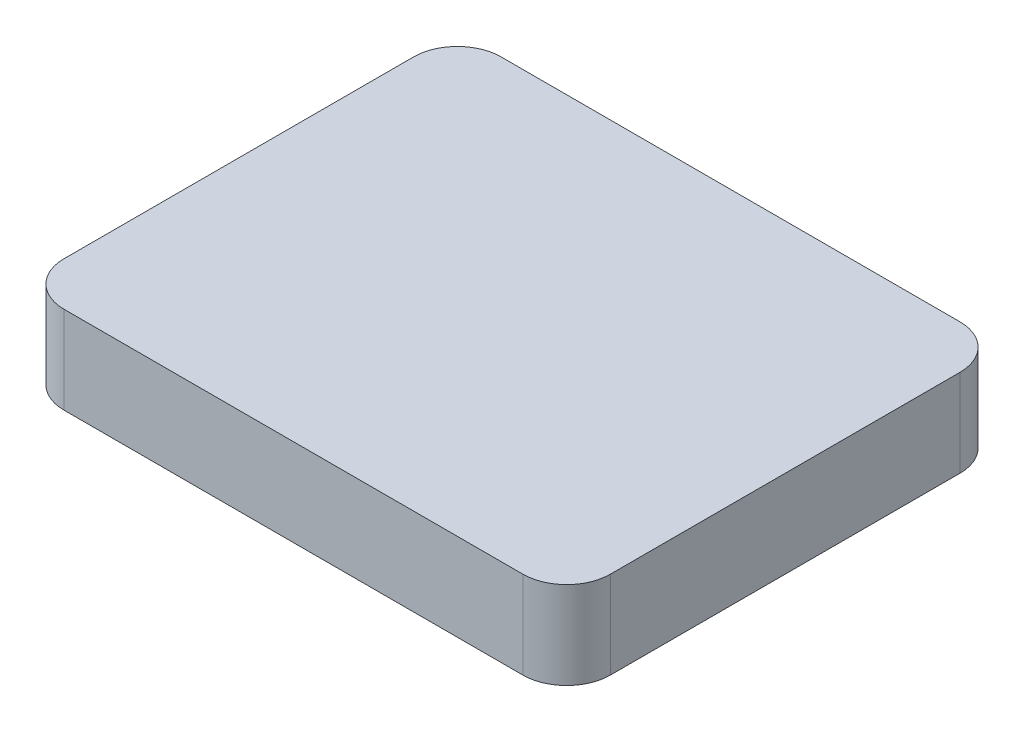
ISO-10303-21;
HEADER;
FILE_DESCRIPTION(('STEP AP214'),'2;1');
FILE_NAME('part.step','',(''),(''),'','','');
FILE_SCHEMA(('AUTOMOTIVE_DESIGN { 1 0 10303 214 1 1 1 1 }'));
ENDSEC;
DATA;
#1=APPLICATION_CONTEXT('core data for automotive mechanical design processes');
#2=APPLICATION_PROTOCOL_DEFINITION('international standard','automotive_design',2000,#1);
#3=PRODUCT_CONTEXT('',#1,'mechanical');
#4=PRODUCT('Part','Part','',(#3));
#5=PRODUCT_RELATED_PRODUCT_CATEGORY('part','',(#4));
#6=PRODUCT_DEFINITION_FORMATION('','',#4);
#7=PRODUCT_DEFINITION_CONTEXT('part definition',#1,'design');
#8=PRODUCT_DEFINITION('design','',#6,#7);
#9=PRODUCT_DEFINITION_SHAPE('','',#8);
#10=(LENGTH_UNIT() NAMED_UNIT(*) SI_UNIT(.MILLI.,.METRE.));
#11=(NAMED_UNIT(*) PLANE_ANGLE_UNIT() SI_UNIT($,.RADIAN.));
#12=(NAMED_UNIT(*) SI_UNIT($,.STERADIAN.) SOLID_ANGLE_UNIT());
#13=UNCERTAINTY_MEASURE_WITH_UNIT(LENGTH_MEASURE(1.E-05),#10,'distance_accuracy_value','');
#14=(GEOMETRIC_REPRESENTATION_CONTEXT(3) GLOBAL_UNCERTAINTY_ASSIGNED_CONTEXT((#13)) GLOBAL_UNIT_ASSIGNED_CONTEXT((#10,
#11,#12)) REPRESENTATION_CONTEXT('',''));
#15=CARTESIAN_POINT('',(0.,0.,0.));
#16=DIRECTION('',(0.,0.,1.));
#17=DIRECTION('',(1.,0.,0.));
#18=AXIS2_PLACEMENT_3D('',#15,#16,#17);
#19=CARTESIAN_POINT('',(125.,40.,-100.));
#20=DIRECTION('',(-1.,0.,0.));
#21=DIRECTION('',(0.,0.,1.));
#22=AXIS2_PLACEMENT_3D('',#19,#20,#21);
#23=PLANE('',#22);
#24=DIRECTION('',(0.,0.,-1.));
#25=VECTOR('',#24,1.);
#26=CARTESIAN_POINT('',(125.,40.,-100.));
#27=LINE('',#26,#25);
#28=CARTESIAN_POINT('',(125.,40.,80.));
#29=VERTEX_POINT('',#28);
#30=CARTESIAN_POINT('',(125.,40.,-80.));
#31=VERTEX_POINT('',#30);
#32=EDGE_CURVE('E118',#29,#31,#27,.T.);
#33=ORIENTED_EDGE('',*,*,#32,.F.);
#34=DIRECTION('',(0.,-1.,0.));
#35=VECTOR('',#34,1.);
#36=CARTESIAN_POINT('',(125.,40.,80.));
#37=LINE('',#36,#35);
#38=CARTESIAN_POINT('',(125.,0.,80.));
#39=VERTEX_POINT('',#38);
#40=EDGE_CURVE('E103',#29,#39,#37,.T.);
#41=ORIENTED_EDGE('',*,*,#40,.T.);
#42=DIRECTION('',(0.,0.,-1.));
#43=VECTOR('',#42,1.);
#44=CARTESIAN_POINT('',(125.,0.,-100.));
#45=LINE('',#44,#43);
#46=CARTESIAN_POINT('',(125.,0.,-80.));
#47=VERTEX_POINT('',#46);
#48=EDGE_CURVE('E115',#39,#47,#45,.T.);
#49=ORIENTED_EDGE('',*,*,#48,.T.);
#50=DIRECTION('',(0.,-1.,0.));
#51=VECTOR('',#50,1.);
#52=CARTESIAN_POINT('',(125.,40.,-80.));
#53=LINE('',#52,#51);
#54=EDGE_CURVE('E120',#47,#31,#53,.F.);
#55=ORIENTED_EDGE('',*,*,#54,.T.);
#56=EDGE_LOOP('',(#33,#41,#49,#55));
#57=FACE_BOUND('',#56,.T.);
#58=ADVANCED_FACE('F33',(#57),#23,.F.);
#59=CARTESIAN_POINT('',(-125.,40.,-100.));
#60=DIRECTION('',(0.,0.,1.));
#61=DIRECTION('',(1.,0.,0.));
#62=AXIS2_PLACEMENT_3D('',#59,#60,#61);
#63=PLANE('',#62);
#64=DIRECTION('',(-1.,0.,0.));
#65=VECTOR('',#64,1.);
#66=CARTESIAN_POINT('',(-125.,0.,-100.));
#67=LINE('',#66,#65);
#68=CARTESIAN_POINT('',(105.,0.,-100.));
#69=VERTEX_POINT('',#68);
#70=CARTESIAN_POINT('',(-105.,0.,-100.));
#71=VERTEX_POINT('',#70);
#72=EDGE_CURVE('E125',#69,#71,#67,.T.);
#73=ORIENTED_EDGE('',*,*,#72,.T.);
#74=DIRECTION('',(0.,-1.,0.));
#75=VECTOR('',#74,1.);
#76=CARTESIAN_POINT('',(-105.,40.,-100.));
#77=LINE('',#76,#75);
#78=CARTESIAN_POINT('',(-105.,40.,-100.));
#79=VERTEX_POINT('',#78);
#80=EDGE_CURVE('E11',#71,#79,#77,.F.);
#81=ORIENTED_EDGE('',*,*,#80,.T.);
#82=DIRECTION('',(-1.,0.,0.));
#83=VECTOR('',#82,1.);
#84=CARTESIAN_POINT('',(-125.,40.,-100.));
#85=LINE('',#84,#83);
#86=CARTESIAN_POINT('',(105.,40.,-100.));
#87=VERTEX_POINT('',#86);
#88=EDGE_CURVE('E160',#87,#79,#85,.T.);
#89=ORIENTED_EDGE('',*,*,#88,.F.);
#90=DIRECTION('',(0.,-1.,0.));
#91=VECTOR('',#90,1.);
#92=CARTESIAN_POINT('',(105.,40.,-100.));
#93=LINE('',#92,#91);
#94=EDGE_CURVE('E41',#87,#69,#93,.T.);
#95=ORIENTED_EDGE('',*,*,#94,.T.);
#96=EDGE_LOOP('',(#73,#81,#89,#95));
#97=FACE_BOUND('',#96,.T.);
#98=ADVANCED_FACE('F158',(#97),#63,.F.);
#99=CARTESIAN_POINT('',(-125.,40.,-100.));
#100=DIRECTION('',(1.,0.,0.));
#101=DIRECTION('',(0.,0.,-1.));
#102=AXIS2_PLACEMENT_3D('',#99,#100,#101);
#103=PLANE('',#102);
#104=DIRECTION('',(0.,0.,1.));
#105=VECTOR('',#104,1.);
#106=CARTESIAN_POINT('',(-125.,40.,-100.));
#107=LINE('',#106,#105);
#108=CARTESIAN_POINT('',(-125.,40.,-80.));
#109=VERTEX_POINT('',#108);
#110=CARTESIAN_POINT('',(-125.,40.,80.));
#111=VERTEX_POINT('',#110);
#112=EDGE_CURVE('E168',#109,#111,#107,.T.);
#113=ORIENTED_EDGE('',*,*,#112,.F.);
#114=DIRECTION('',(0.,-1.,0.));
#115=VECTOR('',#114,1.);
#116=CARTESIAN_POINT('',(-125.,40.,-80.));
#117=LINE('',#116,#115);
#118=CARTESIAN_POINT('',(-125.,0.,-80.));
#119=VERTEX_POINT('',#118);
#120=EDGE_CURVE('E152',#109,#119,#117,.T.);
#121=ORIENTED_EDGE('',*,*,#120,.T.);
#122=DIRECTION('',(0.,0.,1.));
#123=VECTOR('',#122,1.);
#124=CARTESIAN_POINT('',(-125.,0.,-100.));
#125=LINE('',#124,#123);
#126=CARTESIAN_POINT('',(-125.,0.,80.));
#127=VERTEX_POINT('',#126);
#128=EDGE_CURVE('E128',#119,#127,#125,.T.);
#129=ORIENTED_EDGE('',*,*,#128,.T.);
#130=DIRECTION('',(0.,-1.,0.));
#131=VECTOR('',#130,1.);
#132=CARTESIAN_POINT('',(-125.,40.,80.));
#133=LINE('',#132,#131);
#134=EDGE_CURVE('E48',#127,#111,#133,.F.);
#135=ORIENTED_EDGE('',*,*,#134,.T.);
#136=EDGE_LOOP('',(#113,#121,#129,#135));
#137=FACE_BOUND('',#136,.T.);
#138=ADVANCED_FACE('F167',(#137),#103,.F.);
#139=CARTESIAN_POINT('',(-125.,40.,100.));
#140=DIRECTION('',(0.,0.,-1.));
#141=DIRECTION('',(-1.,0.,0.));
#142=AXIS2_PLACEMENT_3D('',#139,#140,#141);
#143=PLANE('',#142);
#144=DIRECTION('',(1.,0.,0.));
#145=VECTOR('',#144,1.);
#146=CARTESIAN_POINT('',(-125.,0.,100.));
#147=LINE('',#146,#145);
#148=CARTESIAN_POINT('',(-105.,0.,100.));
#149=VERTEX_POINT('',#148);
#150=CARTESIAN_POINT('',(105.,0.,100.));
#151=VERTEX_POINT('',#150);
#152=EDGE_CURVE('E135',#149,#151,#147,.T.);
#153=ORIENTED_EDGE('',*,*,#152,.T.);
#154=DIRECTION('',(0.,-1.,0.));
#155=VECTOR('',#154,1.);
#156=CARTESIAN_POINT('',(105.,40.,100.));
#157=LINE('',#156,#155);
#158=CARTESIAN_POINT('',(105.,40.,100.));
#159=VERTEX_POINT('',#158);
#160=EDGE_CURVE('E104',#151,#159,#157,.F.);
#161=ORIENTED_EDGE('',*,*,#160,.T.);
#162=DIRECTION('',(1.,0.,0.));
#163=VECTOR('',#162,1.);
#164=CARTESIAN_POINT('',(-125.,40.,100.));
#165=LINE('',#164,#163);
#166=CARTESIAN_POINT('',(-105.,40.,100.));
#167=VERTEX_POINT('',#166);
#168=EDGE_CURVE('E131',#167,#159,#165,.T.);
#169=ORIENTED_EDGE('',*,*,#168,.F.);
#170=DIRECTION('',(0.,-1.,0.));
#171=VECTOR('',#170,1.);
#172=CARTESIAN_POINT('',(-105.,40.,100.));
#173=LINE('',#172,#171);
#174=EDGE_CURVE('E109',#167,#149,#173,.T.);
#175=ORIENTED_EDGE('',*,*,#174,.T.);
#176=EDGE_LOOP('',(#153,#161,#169,#175));
#177=FACE_BOUND('',#176,.T.);
#178=ADVANCED_FACE('F198',(#177),#143,.F.);
#179=CARTESIAN_POINT('',(0.,40.,0.));
#180=DIRECTION('',(0.,1.,0.));
#181=DIRECTION('',(0.,0.,1.));
#182=AXIS2_PLACEMENT_3D('',#179,#180,#181);
#183=PLANE('',#182);
#184=ORIENTED_EDGE('',*,*,#168,.T.);
#185=CARTESIAN_POINT('',(105.,40.,80.));
#186=DIRECTION('',(0.,1.,0.));
#187=DIRECTION('',(0.,0.,1.));
#188=AXIS2_PLACEMENT_3D('',#185,#186,#187);
#189=CIRCLE('',#188,20.);
#190=EDGE_CURVE('E149',#159,#29,#189,.T.);
#191=ORIENTED_EDGE('',*,*,#190,.T.);
#192=ORIENTED_EDGE('',*,*,#32,.T.);
#193=CARTESIAN_POINT('',(105.,40.,-80.));
#194=DIRECTION('',(0.,1.,0.));
#195=DIRECTION('',(0.,0.,1.));
#196=AXIS2_PLACEMENT_3D('',#193,#194,#195);
#197=CIRCLE('',#196,20.);
#198=EDGE_CURVE('E146',#31,#87,#197,.T.);
#199=ORIENTED_EDGE('',*,*,#198,.T.);
#200=ORIENTED_EDGE('',*,*,#88,.T.);
#201=CARTESIAN_POINT('',(-105.,40.,-80.));
#202=DIRECTION('',(0.,1.,0.));
#203=DIRECTION('',(0.,0.,1.));
#204=AXIS2_PLACEMENT_3D('',#201,#202,#203);
#205=CIRCLE('',#204,20.);
#206=EDGE_CURVE('E55',#79,#109,#205,.T.);
#207=ORIENTED_EDGE('',*,*,#206,.T.);
#208=ORIENTED_EDGE('',*,*,#112,.T.);
#209=CARTESIAN_POINT('',(-105.,40.,80.));
#210=DIRECTION('',(0.,1.,0.));
#211=DIRECTION('',(0.,0.,1.));
#212=AXIS2_PLACEMENT_3D('',#209,#210,#211);
#213=CIRCLE('',#212,20.);
#214=EDGE_CURVE('E144',#111,#167,#213,.T.);
#215=ORIENTED_EDGE('',*,*,#214,.T.);
#216=EDGE_LOOP('',(#184,#191,#192,#199,#200,#207,#208,#215));
#217=FACE_BOUND('',#216,.T.);
#218=ADVANCED_FACE('F173',(#217),#183,.T.);
#219=CARTESIAN_POINT('',(0.,0.,0.));
#220=DIRECTION('',(0.,1.,0.));
#221=DIRECTION('',(0.,0.,1.));
#222=AXIS2_PLACEMENT_3D('',#219,#220,#221);
#223=PLANE('',#222);
#224=ORIENTED_EDGE('',*,*,#48,.F.);
#225=CARTESIAN_POINT('',(105.,0.,80.));
#226=DIRECTION('',(0.,1.,0.));
#227=DIRECTION('',(0.,0.,1.));
#228=AXIS2_PLACEMENT_3D('',#225,#226,#227);
#229=CIRCLE('',#228,20.);
#230=EDGE_CURVE('E99',#39,#151,#229,.F.);
#231=ORIENTED_EDGE('',*,*,#230,.T.);
#232=ORIENTED_EDGE('',*,*,#152,.F.);
#233=CARTESIAN_POINT('',(-105.,0.,80.));
#234=DIRECTION('',(0.,1.,0.));
#235=DIRECTION('',(0.,0.,1.));
#236=AXIS2_PLACEMENT_3D('',#233,#234,#235);
#237=CIRCLE('',#236,20.);
#238=EDGE_CURVE('E119',#149,#127,#237,.F.);
#239=ORIENTED_EDGE('',*,*,#238,.T.);
#240=ORIENTED_EDGE('',*,*,#128,.F.);
#241=CARTESIAN_POINT('',(-105.,0.,-80.));
#242=DIRECTION('',(0.,1.,0.));
#243=DIRECTION('',(0.,0.,1.));
#244=AXIS2_PLACEMENT_3D('',#241,#242,#243);
#245=CIRCLE('',#244,20.);
#246=EDGE_CURVE('E110',#119,#71,#245,.F.);
#247=ORIENTED_EDGE('',*,*,#246,.T.);
#248=ORIENTED_EDGE('',*,*,#72,.F.);
#249=CARTESIAN_POINT('',(105.,0.,-80.));
#250=DIRECTION('',(0.,1.,0.));
#251=DIRECTION('',(0.,0.,1.));
#252=AXIS2_PLACEMENT_3D('',#249,#250,#251);
#253=CIRCLE('',#252,20.);
#254=EDGE_CURVE('E124',#69,#47,#253,.F.);
#255=ORIENTED_EDGE('',*,*,#254,.T.);
#256=EDGE_LOOP('',(#224,#231,#232,#239,#240,#247,#248,#255));
#257=FACE_BOUND('',#256,.T.);
#258=ADVANCED_FACE('F122',(#257),#223,.F.);
#259=CARTESIAN_POINT('',(105.,40.,80.));
#260=DIRECTION('',(0.,-1.,0.));
#261=DIRECTION('',(0.,0.,-1.));
#262=AXIS2_PLACEMENT_3D('',#259,#260,#261);
#263=CYLINDRICAL_SURFACE('',#262,20.);
#264=ORIENTED_EDGE('',*,*,#190,.F.);
#265=ORIENTED_EDGE('',*,*,#160,.F.);
#266=ORIENTED_EDGE('',*,*,#230,.F.);
#267=ORIENTED_EDGE('',*,*,#40,.F.);
#268=EDGE_LOOP('',(#264,#265,#266,#267));
#269=FACE_BOUND('',#268,.T.);
#270=ADVANCED_FACE('F102',(#269),#263,.T.);
#271=CARTESIAN_POINT('',(-105.,40.,-80.));
#272=DIRECTION('',(0.,-1.,0.));
#273=DIRECTION('',(0.,0.,-1.));
#274=AXIS2_PLACEMENT_3D('',#271,#272,#273);
#275=CYLINDRICAL_SURFACE('',#274,20.);
#276=ORIENTED_EDGE('',*,*,#206,.F.);
#277=ORIENTED_EDGE('',*,*,#80,.F.);
#278=ORIENTED_EDGE('',*,*,#246,.F.);
#279=ORIENTED_EDGE('',*,*,#120,.F.);
#280=EDGE_LOOP('',(#276,#277,#278,#279));
#281=FACE_BOUND('',#280,.T.);
#282=ADVANCED_FACE('F166',(#281),#275,.T.);
#283=CARTESIAN_POINT('',(105.,40.,-80.));
#284=DIRECTION('',(0.,-1.,0.));
#285=DIRECTION('',(0.,0.,-1.));
#286=AXIS2_PLACEMENT_3D('',#283,#284,#285);
#287=CYLINDRICAL_SURFACE('',#286,20.);
#288=ORIENTED_EDGE('',*,*,#198,.F.);
#289=ORIENTED_EDGE('',*,*,#54,.F.);
#290=ORIENTED_EDGE('',*,*,#254,.F.);
#291=ORIENTED_EDGE('',*,*,#94,.F.);
#292=EDGE_LOOP('',(#288,#289,#290,#291));
#293=FACE_BOUND('',#292,.T.);
#294=ADVANCED_FACE('F174',(#293),#287,.T.);
#295=CARTESIAN_POINT('',(-105.,40.,80.));
#296=DIRECTION('',(0.,-1.,0.));
#297=DIRECTION('',(0.,0.,-1.));
#298=AXIS2_PLACEMENT_3D('',#295,#296,#297);
#299=CYLINDRICAL_SURFACE('',#298,20.);
#300=ORIENTED_EDGE('',*,*,#214,.F.);
#301=ORIENTED_EDGE('',*,*,#134,.F.);
#302=ORIENTED_EDGE('',*,*,#238,.F.);
#303=ORIENTED_EDGE('',*,*,#174,.F.);
#304=EDGE_LOOP('',(#300,#301,#302,#303));
#305=FACE_BOUND('',#304,.T.);
#306=ADVANCED_FACE('F35',(#305),#299,.T.);
#307=CLOSED_SHELL('',(#58,#98,#138,#178,#218,#258,#270,#282,#294,#306));
#308=MANIFOLD_SOLID_BREP('B2',#307);
#309=ADVANCED_BREP_SHAPE_REPRESENTATION('',(#18,#308),#14);
#310=SHAPE_DEFINITION_REPRESENTATION(#9,#309);
ENDSEC;
END-ISO-10303-21;
